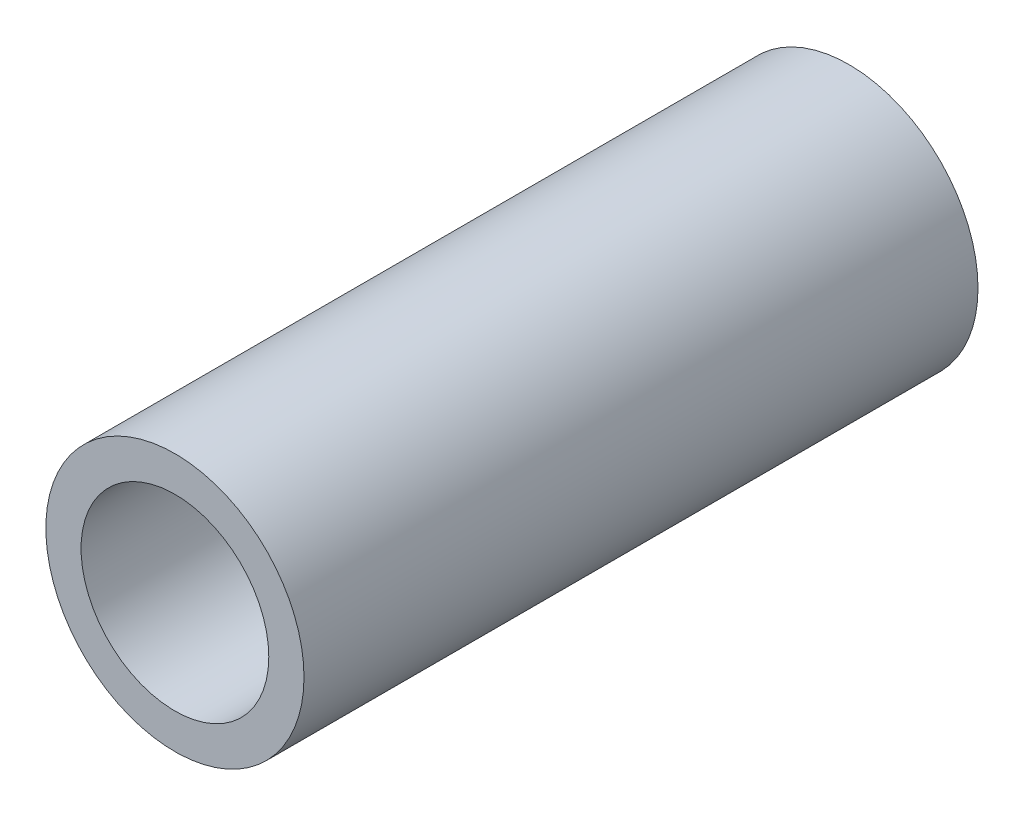
ISO-10303-21;
HEADER;
FILE_DESCRIPTION(('STEP AP214'),'2;1');
FILE_NAME('part.step','',(''),(''),'','','');
FILE_SCHEMA(('AUTOMOTIVE_DESIGN { 1 0 10303 214 1 1 1 1 }'));
ENDSEC;
DATA;
#1=APPLICATION_CONTEXT('core data for automotive mechanical design processes');
#2=APPLICATION_PROTOCOL_DEFINITION('international standard','automotive_design',2000,#1);
#3=PRODUCT_CONTEXT('',#1,'mechanical');
#4=PRODUCT('Part','Part','',(#3));
#5=PRODUCT_RELATED_PRODUCT_CATEGORY('part','',(#4));
#6=PRODUCT_DEFINITION_FORMATION('','',#4);
#7=PRODUCT_DEFINITION_CONTEXT('part definition',#1,'design');
#8=PRODUCT_DEFINITION('design','',#6,#7);
#9=PRODUCT_DEFINITION_SHAPE('','',#8);
#10=(LENGTH_UNIT() NAMED_UNIT(*) SI_UNIT(.MILLI.,.METRE.));
#11=(NAMED_UNIT(*) PLANE_ANGLE_UNIT() SI_UNIT($,.RADIAN.));
#12=(NAMED_UNIT(*) SI_UNIT($,.STERADIAN.) SOLID_ANGLE_UNIT());
#13=UNCERTAINTY_MEASURE_WITH_UNIT(LENGTH_MEASURE(1.E-05),#10,'distance_accuracy_value','');
#14=(GEOMETRIC_REPRESENTATION_CONTEXT(3) GLOBAL_UNCERTAINTY_ASSIGNED_CONTEXT((#13)) GLOBAL_UNIT_ASSIGNED_CONTEXT((#10,
#11,#12)) REPRESENTATION_CONTEXT('',''));
#15=CARTESIAN_POINT('',(0.,0.,0.));
#16=DIRECTION('',(0.,0.,1.));
#17=DIRECTION('',(1.,0.,0.));
#18=AXIS2_PLACEMENT_3D('',#15,#16,#17);
#19=CARTESIAN_POINT('',(0.,0.,182.372));
#20=DIRECTION('',(0.,0.,1.));
#21=DIRECTION('',(1.,0.,0.));
#22=AXIS2_PLACEMENT_3D('',#19,#20,#21);
#23=PLANE('',#22);
#24=CARTESIAN_POINT('',(0.,0.,182.372));
#25=DIRECTION('',(0.,0.,1.));
#26=DIRECTION('',(1.,0.,0.));
#27=AXIS2_PLACEMENT_3D('',#24,#25,#26);
#28=CIRCLE('',#27,34.925);
#29=CARTESIAN_POINT('',(34.925,0.,182.372));
#30=VERTEX_POINT('',#29);
#31=EDGE_CURVE('E10',#30,#30,#28,.T.);
#32=ORIENTED_EDGE('',*,*,#31,.T.);
#33=EDGE_LOOP('',(#32));
#34=FACE_BOUND('',#33,.T.);
#35=CARTESIAN_POINT('',(0.,0.,182.372));
#36=DIRECTION('',(0.,0.,1.));
#37=DIRECTION('',(1.,0.,0.));
#38=AXIS2_PLACEMENT_3D('',#35,#36,#37);
#39=CIRCLE('',#38,25.4);
#40=CARTESIAN_POINT('',(25.4,0.,182.372));
#41=VERTEX_POINT('',#40);
#42=EDGE_CURVE('E44',#41,#41,#39,.T.);
#43=ORIENTED_EDGE('',*,*,#42,.F.);
#44=EDGE_LOOP('',(#43));
#45=FACE_BOUND('',#44,.T.);
#46=ADVANCED_FACE('F33',(#34,#45),#23,.T.);
#47=CARTESIAN_POINT('',(0.,0.,0.));
#48=DIRECTION('',(0.,0.,1.));
#49=DIRECTION('',(1.,0.,0.));
#50=AXIS2_PLACEMENT_3D('',#47,#48,#49);
#51=PLANE('',#50);
#52=CARTESIAN_POINT('',(0.,0.,0.));
#53=DIRECTION('',(0.,0.,1.));
#54=DIRECTION('',(1.,0.,0.));
#55=AXIS2_PLACEMENT_3D('',#52,#53,#54);
#56=CIRCLE('',#55,34.925);
#57=CARTESIAN_POINT('',(34.925,0.,0.));
#58=VERTEX_POINT('',#57);
#59=EDGE_CURVE('E37',#58,#58,#56,.T.);
#60=ORIENTED_EDGE('',*,*,#59,.F.);
#61=EDGE_LOOP('',(#60));
#62=FACE_BOUND('',#61,.T.);
#63=CARTESIAN_POINT('',(0.,0.,0.));
#64=DIRECTION('',(0.,0.,1.));
#65=DIRECTION('',(1.,0.,0.));
#66=AXIS2_PLACEMENT_3D('',#63,#64,#65);
#67=CIRCLE('',#66,25.4);
#68=CARTESIAN_POINT('',(25.4,0.,0.));
#69=VERTEX_POINT('',#68);
#70=EDGE_CURVE('E46',#69,#69,#67,.T.);
#71=ORIENTED_EDGE('',*,*,#70,.T.);
#72=EDGE_LOOP('',(#71));
#73=FACE_BOUND('',#72,.T.);
#74=ADVANCED_FACE('F56',(#62,#73),#51,.F.);
#75=CARTESIAN_POINT('',(0.,0.,182.372));
#76=DIRECTION('',(0.,0.,-1.));
#77=DIRECTION('',(-1.,0.,0.));
#78=AXIS2_PLACEMENT_3D('',#75,#76,#77);
#79=CYLINDRICAL_SURFACE('',#78,34.925);
#80=ORIENTED_EDGE('',*,*,#31,.F.);
#81=EDGE_LOOP('',(#80));
#82=FACE_BOUND('',#81,.T.);
#83=ORIENTED_EDGE('',*,*,#59,.T.);
#84=EDGE_LOOP('',(#83));
#85=FACE_BOUND('',#84,.T.);
#86=ADVANCED_FACE('F35',(#82,#85),#79,.T.);
#87=CARTESIAN_POINT('',(0.,0.,182.372));
#88=DIRECTION('',(0.,0.,-1.));
#89=DIRECTION('',(-1.,0.,0.));
#90=AXIS2_PLACEMENT_3D('',#87,#88,#89);
#91=CYLINDRICAL_SURFACE('',#90,25.4);
#92=ORIENTED_EDGE('',*,*,#42,.T.);
#93=EDGE_LOOP('',(#92));
#94=FACE_BOUND('',#93,.T.);
#95=ORIENTED_EDGE('',*,*,#70,.F.);
#96=EDGE_LOOP('',(#95));
#97=FACE_BOUND('',#96,.T.);
#98=ADVANCED_FACE('F52',(#94,#97),#91,.F.);
#99=CLOSED_SHELL('',(#46,#74,#86,#98));
#100=MANIFOLD_SOLID_BREP('B2',#99);
#101=ADVANCED_BREP_SHAPE_REPRESENTATION('',(#18,#100),#14);
#102=SHAPE_DEFINITION_REPRESENTATION(#9,#101);
ENDSEC;
END-ISO-10303-21;
